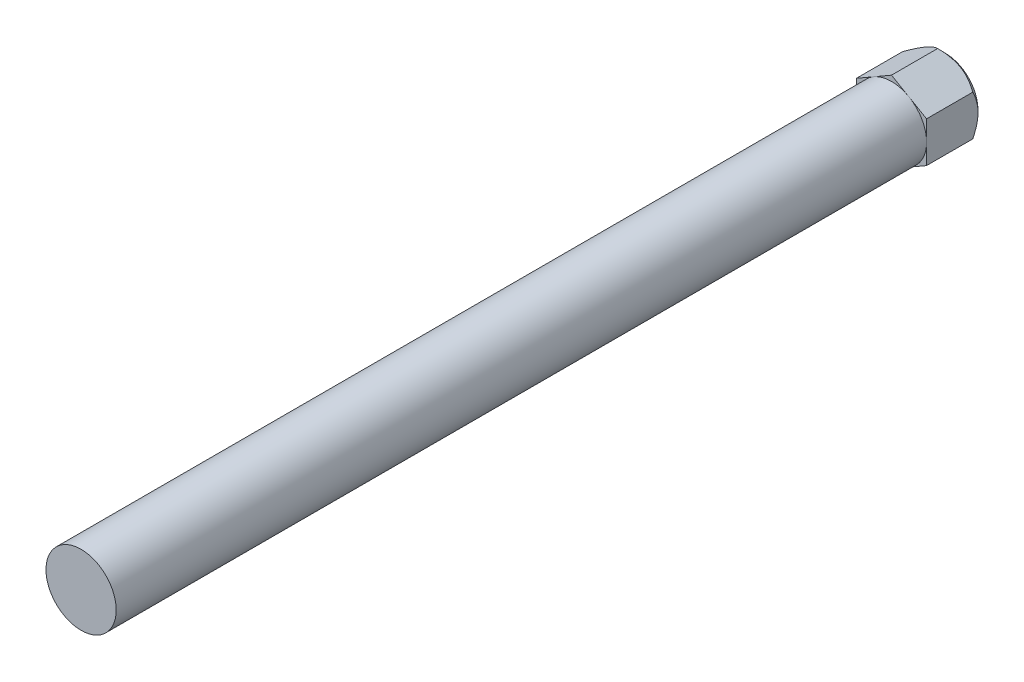
ISO-10303-21;
HEADER;
FILE_DESCRIPTION(('STEP AP214'),'2;1');
FILE_NAME('part.step','',(''),(''),'','','');
FILE_SCHEMA(('AUTOMOTIVE_DESIGN { 1 0 10303 214 1 1 1 1 }'));
ENDSEC;
DATA;
#1=APPLICATION_CONTEXT('core data for automotive mechanical design processes');
#2=APPLICATION_PROTOCOL_DEFINITION('international standard','automotive_design',2000,#1);
#3=PRODUCT_CONTEXT('',#1,'mechanical');
#4=PRODUCT('Part','Part','',(#3));
#5=PRODUCT_RELATED_PRODUCT_CATEGORY('part','',(#4));
#6=PRODUCT_DEFINITION_FORMATION('','',#4);
#7=PRODUCT_DEFINITION_CONTEXT('part definition',#1,'design');
#8=PRODUCT_DEFINITION('design','',#6,#7);
#9=PRODUCT_DEFINITION_SHAPE('','',#8);
#10=(LENGTH_UNIT() NAMED_UNIT(*) SI_UNIT(.MILLI.,.METRE.));
#11=(NAMED_UNIT(*) PLANE_ANGLE_UNIT() SI_UNIT($,.RADIAN.));
#12=(NAMED_UNIT(*) SI_UNIT($,.STERADIAN.) SOLID_ANGLE_UNIT());
#13=UNCERTAINTY_MEASURE_WITH_UNIT(LENGTH_MEASURE(1.E-05),#10,'distance_accuracy_value','');
#14=(GEOMETRIC_REPRESENTATION_CONTEXT(3) GLOBAL_UNCERTAINTY_ASSIGNED_CONTEXT((#13)) GLOBAL_UNIT_ASSIGNED_CONTEXT((#10,
#11,#12)) REPRESENTATION_CONTEXT('',''));
#15=CARTESIAN_POINT('',(0.,0.,0.));
#16=DIRECTION('',(0.,0.,1.));
#17=DIRECTION('',(1.,0.,0.));
#18=AXIS2_PLACEMENT_3D('',#15,#16,#17);
#19=CARTESIAN_POINT('',(0.129903810567665,0.0750000000000015,0.2));
#20=DIRECTION('',(-0.499999999999995,-0.866025403784441,0.));
#21=DIRECTION('',(0.866025403784441,-0.499999999999995,0.));
#22=AXIS2_PLACEMENT_3D('',#19,#20,#21);
#23=PLANE('',#22);
#24=CARTESIAN_POINT('',(-0.000225000000000034,0.150129903810568,0.0290416925238595));
#25=CARTESIAN_POINT('',(0.00440493001549842,0.147456812469791,0.0264662805790906));
#26=CARTESIAN_POINT('',(0.00910132930384536,0.144745345076442,0.024046366710727));
#27=CARTESIAN_POINT('',(0.0186727421920923,0.139219287268887,0.0196362097813889));
#28=CARTESIAN_POINT('',(0.0235486264427722,0.13640419418422,0.0176485132737686));
#29=CARTESIAN_POINT('',(0.0382402759105472,0.12792196640916,0.0126229968253295));
#30=CARTESIAN_POINT('',(0.0483001338299162,0.122113904731403,0.0104117823770408));
#31=CARTESIAN_POINT('',(0.0658404412441981,0.111987003524099,0.0092767657100801));
#32=CARTESIAN_POINT('',(0.0732867789702007,0.107687858433515,0.00962863214526663));
#33=CARTESIAN_POINT('',(0.0880016636542663,0.0991922158000751,0.0118879441990818));
#34=CARTESIAN_POINT('',(0.0952699155190242,0.0949958886294192,0.0137978127130971));
#35=CARTESIAN_POINT('',(0.107152446289047,0.0881355062906924,0.0179691136598692));
#36=CARTESIAN_POINT('',(0.111857024988693,0.0854193165120283,0.019911088131961));
#37=CARTESIAN_POINT('',(0.121106132544701,0.0800793417748031,0.0242007570717486));
#38=CARTESIAN_POINT('',(0.125651196440504,0.0774552479110774,0.0265468993747505));
#39=CARTESIAN_POINT('',(0.130128810567773,0.0748700961893716,0.0290416925234508));
#40=B_SPLINE_CURVE_WITH_KNOTS('',3,(#24,#25,#26,#27,#28,#29,#30,#31,#32,#33,#34,#35,#36,#37,#38,
#39),.UNSPECIFIED.,.F.,.F.,(4,2,2,2,2,2,2,4),(0.,0.0177981026650243,0.0356983863816638,
0.0708014543016663,0.0964614096499663,0.122161345802402,0.139452968543099,0.156679607584544),.UNSPECIFIED.);
#41=CARTESIAN_POINT('',(0.,0.15,0.0289163186776053));
#42=VERTEX_POINT('',#41);
#43=CARTESIAN_POINT('',(0.129903810567665,0.0750000000000015,0.0289163186776074));
#44=VERTEX_POINT('',#43);
#45=EDGE_CURVE('E55',#42,#44,#40,.T.);
#46=ORIENTED_EDGE('',*,*,#45,.F.);
#47=DIRECTION('',(0.,0.,-1.));
#48=VECTOR('',#47,1.);
#49=CARTESIAN_POINT('',(0.,0.15,0.2));
#50=LINE('',#49,#48);
#51=CARTESIAN_POINT('',(0.,0.15,0.2));
#52=VERTEX_POINT('',#51);
#53=EDGE_CURVE('E164',#52,#42,#50,.T.);
#54=ORIENTED_EDGE('',*,*,#53,.F.);
#55=DIRECTION('',(-0.866025403784442,0.499999999999995,0.));
#56=VECTOR('',#55,1.);
#57=CARTESIAN_POINT('',(0.129903810567665,0.0750000000000015,0.2));
#58=LINE('',#57,#56);
#59=CARTESIAN_POINT('',(0.0606217782649196,0.114999999999995,0.2));
#60=VERTEX_POINT('',#59);
#61=EDGE_CURVE('E41',#60,#52,#58,.T.);
#62=ORIENTED_EDGE('',*,*,#61,.F.);
#63=CARTESIAN_POINT('',(0.,0.,0.2));
#64=DIRECTION('',(0.,0.,1.));
#65=DIRECTION('',(0.532938710021118,0.846153846153893,0.));
#66=AXIS2_PLACEMENT_3D('',#63,#64,#65);
#67=CIRCLE('',#66,0.13);
#68=CARTESIAN_POINT('',(0.0692820323027454,0.110000000000006,0.2));
#69=VERTEX_POINT('',#68);
#70=EDGE_CURVE('E361',#69,#60,#67,.T.);
#71=ORIENTED_EDGE('',*,*,#70,.F.);
#72=CARTESIAN_POINT('',(0.129903810567665,0.0750000000000015,0.2));
#73=VERTEX_POINT('',#72);
#74=EDGE_CURVE('E372',#73,#69,#58,.T.);
#75=ORIENTED_EDGE('',*,*,#74,.F.);
#76=DIRECTION('',(0.,0.,-1.));
#77=VECTOR('',#76,1.);
#78=CARTESIAN_POINT('',(0.129903810567665,0.0750000000000015,0.2));
#79=LINE('',#78,#77);
#80=EDGE_CURVE('E158',#73,#44,#79,.T.);
#81=ORIENTED_EDGE('',*,*,#80,.T.);
#82=EDGE_LOOP('',(#46,#54,#62,#71,#75,#81));
#83=FACE_BOUND('',#82,.T.);
#84=ADVANCED_FACE('F37',(#83),#23,.F.);
#85=CARTESIAN_POINT('',(0.,0.15,0.2));
#86=DIRECTION('',(0.500000000000001,-0.866025403784438,0.));
#87=DIRECTION('',(0.866025403784438,0.500000000000001,0.));
#88=AXIS2_PLACEMENT_3D('',#85,#86,#87);
#89=PLANE('',#88);
#90=CARTESIAN_POINT('',(-0.130128810567666,0.074870096189432,0.02904169252386));
#91=CARTESIAN_POINT('',(-0.125498880552167,0.0775431875302092,0.026466280579091));
#92=CARTESIAN_POINT('',(-0.120802481263821,0.0802546549235583,0.0240463667107274));
#93=CARTESIAN_POINT('',(-0.111231068375574,0.0857807127311127,0.0196362097813891));
#94=CARTESIAN_POINT('',(-0.106355184124894,0.0885958058157803,0.0176485132737687));
#95=CARTESIAN_POINT('',(-0.0916635346571185,0.0970780335908399,0.0126229968253294));
#96=CARTESIAN_POINT('',(-0.0816036767377495,0.102886095268597,0.0104117823770405));
#97=CARTESIAN_POINT('',(-0.0640633693234676,0.113012996475901,0.00927676571007957));
#98=CARTESIAN_POINT('',(-0.056617031597465,0.117312141566486,0.00962863214526604));
#99=CARTESIAN_POINT('',(-0.0419021469133995,0.125807784199925,0.0118879441990811));
#100=CARTESIAN_POINT('',(-0.0346338950486416,0.130004111370581,0.0137978127130963));
#101=CARTESIAN_POINT('',(-0.0227513642786183,0.136864493709308,0.0179691136598683));
#102=CARTESIAN_POINT('',(-0.0180467855789726,0.139580683487973,0.0199110881319602));
#103=CARTESIAN_POINT('',(-0.00879767802296392,0.144920658225198,0.0242007570717479));
#104=CARTESIAN_POINT('',(-0.00425261412716102,0.147544752088924,0.0265468993747499));
#105=CARTESIAN_POINT('',(0.000225000000107818,0.15012990381063,0.0290416925234503));
#106=B_SPLINE_CURVE_WITH_KNOTS('',3,(#90,#91,#92,#93,#94,#95,#96,#97,#98,#99,#100,#101,#102,
#103,#104,#105),.UNSPECIFIED.,.F.,.F.,(4,2,2,2,2,2,2,4),(0.,0.0177981026650245,
0.0356983863816643,0.0708014543016672,0.0964614096499672,0.122161345802402,0.1394529685431,
0.156679607584546),.UNSPECIFIED.);
#107=CARTESIAN_POINT('',(-0.129903810567666,0.0749999999999996,0.0289163186776059));
#108=VERTEX_POINT('',#107);
#109=EDGE_CURVE('E232',#108,#42,#106,.T.);
#110=ORIENTED_EDGE('',*,*,#109,.F.);
#111=DIRECTION('',(0.,0.,-1.));
#112=VECTOR('',#111,1.);
#113=CARTESIAN_POINT('',(-0.129903810567666,0.0749999999999997,0.2));
#114=LINE('',#113,#112);
#115=CARTESIAN_POINT('',(-0.129903810567666,0.0749999999999997,0.2));
#116=VERTEX_POINT('',#115);
#117=EDGE_CURVE('E156',#116,#108,#114,.T.);
#118=ORIENTED_EDGE('',*,*,#117,.F.);
#119=DIRECTION('',(-0.866025403784438,-0.500000000000001,0.));
#120=VECTOR('',#119,1.);
#121=CARTESIAN_POINT('',(0.,0.15,0.2));
#122=LINE('',#121,#120);
#123=CARTESIAN_POINT('',(-0.0692820323027576,0.109999999999998,0.2));
#124=VERTEX_POINT('',#123);
#125=EDGE_CURVE('E374',#124,#116,#122,.T.);
#126=ORIENTED_EDGE('',*,*,#125,.F.);
#127=CARTESIAN_POINT('',(0.,0.,0.2));
#128=DIRECTION('',(0.,0.,1.));
#129=DIRECTION('',(-0.466321371268526,0.884615384615394,0.));
#130=AXIS2_PLACEMENT_3D('',#127,#128,#129);
#131=CIRCLE('',#130,0.13);
#132=CARTESIAN_POINT('',(-0.0606217782649084,0.115000000000001,0.2));
#133=VERTEX_POINT('',#132);
#134=EDGE_CURVE('E386',#133,#124,#131,.T.);
#135=ORIENTED_EDGE('',*,*,#134,.F.);
#136=EDGE_CURVE('E260',#52,#133,#122,.T.);
#137=ORIENTED_EDGE('',*,*,#136,.F.);
#138=ORIENTED_EDGE('',*,*,#53,.T.);
#139=EDGE_LOOP('',(#110,#118,#126,#135,#137,#138));
#140=FACE_BOUND('',#139,.T.);
#141=ADVANCED_FACE('F242',(#140),#89,.F.);
#142=CARTESIAN_POINT('',(-0.129903810567666,0.0749999999999997,0.2));
#143=DIRECTION('',(1.,0.,0.));
#144=DIRECTION('',(0.,1.,0.));
#145=AXIS2_PLACEMENT_3D('',#142,#143,#144);
#146=PLANE('',#145);
#147=CARTESIAN_POINT('',(-0.129903810567665,-0.0752250000000006,0.0290248767718918));
#148=CARTESIAN_POINT('',(-0.129903810567665,-0.0698809621175126,0.0264513776861215));
#149=CARTESIAN_POINT('',(-0.129903810567665,-0.0644602116700959,0.0240333468260614));
#150=CARTESIAN_POINT('',(-0.129903810567666,-0.0534126724141966,0.0196267725487518));
#151=CARTESIAN_POINT('',(-0.129903810567666,-0.047784880507002,0.0176407710038119));
#152=CARTESIAN_POINT('',(-0.129903810567666,-0.0308276142680169,0.0126196439930497));
#153=CARTESIAN_POINT('',(-0.129903810567666,-0.0192165977609575,0.0104106359543872));
#154=CARTESIAN_POINT('',(-0.129903810567666,0.00103175531092446,0.00927682483446629));
#155=CARTESIAN_POINT('',(-0.129903810567666,0.00962981045664214,0.00962904722870794));
#156=CARTESIAN_POINT('',(-0.129903810567666,0.0266205653232763,0.0118889307188861));
#157=CARTESIAN_POINT('',(-0.129903810567666,0.0350129247736064,0.0137990106921823));
#158=CARTESIAN_POINT('',(-0.129903810567666,0.0487264351488756,0.0179684949926959));
#159=CARTESIAN_POINT('',(-0.129903810567666,0.0541520661260957,0.0199078316637676));
#160=CARTESIAN_POINT('',(-0.129903810567666,0.0648189515033825,0.0241913045376229));
#161=CARTESIAN_POINT('',(-0.129903810567666,0.0700608220810997,0.0265338923656567));
#162=CARTESIAN_POINT('',(-0.129903810567666,0.0752250000001232,0.0290248767714845));
#163=B_SPLINE_CURVE_WITH_KNOTS('',3,(#147,#148,#149,#150,#151,#152,#153,#154,#155,#156,#157,
#158,#159,#160,#161,#162),.UNSPECIFIED.,.F.,.F.,(4,2,2,2,2,2,2,4),(0.,0.0177898229142681,
0.0356816405905399,0.0707688613278053,0.0964281734925292,0.122127402756694,0.139397361419401,
0.156602429884738),.UNSPECIFIED.);
#164=CARTESIAN_POINT('',(-0.129903810567664,-0.0750000000000025,0.0289163186776069));
#165=VERTEX_POINT('',#164);
#166=EDGE_CURVE('E149',#165,#108,#163,.T.);
#167=ORIENTED_EDGE('',*,*,#166,.F.);
#168=DIRECTION('',(0.,0.,-1.));
#169=VECTOR('',#168,1.);
#170=CARTESIAN_POINT('',(-0.129903810567665,-0.0750000000000006,0.2));
#171=LINE('',#170,#169);
#172=CARTESIAN_POINT('',(-0.129903810567665,-0.0750000000000006,0.2));
#173=VERTEX_POINT('',#172);
#174=EDGE_CURVE('E148',#173,#165,#171,.T.);
#175=ORIENTED_EDGE('',*,*,#174,.F.);
#176=DIRECTION('',(0.,-1.,0.));
#177=VECTOR('',#176,1.);
#178=CARTESIAN_POINT('',(-0.129903810567666,0.0749999999999997,0.2));
#179=LINE('',#178,#177);
#180=CARTESIAN_POINT('',(-0.129903810567666,-0.00500000000000326,0.2));
#181=VERTEX_POINT('',#180);
#182=EDGE_CURVE('E311',#181,#173,#179,.T.);
#183=ORIENTED_EDGE('',*,*,#182,.F.);
#184=CARTESIAN_POINT('',(0.,0.,0.2));
#185=DIRECTION('',(0.,0.,1.));
#186=DIRECTION('',(-0.999260081289736,0.0384615384615572,0.));
#187=AXIS2_PLACEMENT_3D('',#184,#185,#186);
#188=CIRCLE('',#187,0.13);
#189=CARTESIAN_POINT('',(-0.129903810567666,0.00500000000000241,0.2));
#190=VERTEX_POINT('',#189);
#191=EDGE_CURVE('E315',#190,#181,#188,.T.);
#192=ORIENTED_EDGE('',*,*,#191,.F.);
#193=EDGE_CURVE('E321',#116,#190,#179,.T.);
#194=ORIENTED_EDGE('',*,*,#193,.F.);
#195=ORIENTED_EDGE('',*,*,#117,.T.);
#196=EDGE_LOOP('',(#167,#175,#183,#192,#194,#195));
#197=FACE_BOUND('',#196,.T.);
#198=ADVANCED_FACE('F245',(#197),#146,.F.);
#199=CARTESIAN_POINT('',(-0.129903810567665,-0.0750000000000006,0.2));
#200=DIRECTION('',(0.499999999999995,0.866025403784442,0.));
#201=DIRECTION('',(-0.866025403784442,0.499999999999995,0.));
#202=AXIS2_PLACEMENT_3D('',#199,#200,#201);
#203=PLANE('',#202);
#204=CARTESIAN_POINT('',(0.000225000000001057,-0.150129903810568,0.0290416925238618));
#205=CARTESIAN_POINT('',(-0.00440493001549743,-0.147456812469791,0.0264662805790928));
#206=CARTESIAN_POINT('',(-0.00910132930384438,-0.144745345076441,0.0240463667107292));
#207=CARTESIAN_POINT('',(-0.0186727421920913,-0.139219287268887,0.0196362097813909));
#208=CARTESIAN_POINT('',(-0.0235486264427713,-0.13640419418422,0.0176485132737704));
#209=CARTESIAN_POINT('',(-0.0382402759105464,-0.12792196640916,0.0126229968253311));
#210=CARTESIAN_POINT('',(-0.0483001338299154,-0.122113904731403,0.0104117823770422));
#211=CARTESIAN_POINT('',(-0.0658404412441974,-0.111987003524099,0.00927676571008123));
#212=CARTESIAN_POINT('',(-0.0732867789701999,-0.107687858433514,0.00962863214526765));
#213=CARTESIAN_POINT('',(-0.0880016636542653,-0.0991922158000751,0.0118879441990826));
#214=CARTESIAN_POINT('',(-0.0952699155190232,-0.0949958886294192,0.0137978127130978));
#215=CARTESIAN_POINT('',(-0.107152446289047,-0.0881355062906923,0.0179691136598698));
#216=CARTESIAN_POINT('',(-0.111857024988692,-0.085419316512028,0.0199110881319618));
#217=CARTESIAN_POINT('',(-0.121106132544701,-0.0800793417748025,0.0242007570717495));
#218=CARTESIAN_POINT('',(-0.125651196440504,-0.0774552479110766,0.0265468993747516));
#219=CARTESIAN_POINT('',(-0.130128810567773,-0.0748700961893707,0.0290416925234521));
#220=B_SPLINE_CURVE_WITH_KNOTS('',3,(#204,#205,#206,#207,#208,#209,#210,#211,#212,#213,#214,
#215,#216,#217,#218,#219),.UNSPECIFIED.,.F.,.F.,(4,2,2,2,2,2,2,4),(0.,0.0177981026650245,
0.0356983863816642,0.070801454301667,0.0964614096499667,0.122161345802402,0.1394529685431,
0.156679607584546),.UNSPECIFIED.);
#221=CARTESIAN_POINT('',(0.,-0.15,0.0289163186776074));
#222=VERTEX_POINT('',#221);
#223=EDGE_CURVE('E131',#222,#165,#220,.T.);
#224=ORIENTED_EDGE('',*,*,#223,.F.);
#225=DIRECTION('',(0.,0.,-1.));
#226=VECTOR('',#225,1.);
#227=CARTESIAN_POINT('',(0.,-0.15,0.2));
#228=LINE('',#227,#226);
#229=CARTESIAN_POINT('',(0.,-0.15,0.2));
#230=VERTEX_POINT('',#229);
#231=EDGE_CURVE('E144',#230,#222,#228,.T.);
#232=ORIENTED_EDGE('',*,*,#231,.F.);
#233=DIRECTION('',(0.866025403784442,-0.499999999999995,0.));
#234=VECTOR('',#233,1.);
#235=CARTESIAN_POINT('',(-0.129903810567665,-0.0750000000000006,0.2));
#236=LINE('',#235,#234);
#237=CARTESIAN_POINT('',(-0.0606217782649069,-0.115000000000002,0.2));
#238=VERTEX_POINT('',#237);
#239=EDGE_CURVE('E291',#238,#230,#236,.T.);
#240=ORIENTED_EDGE('',*,*,#239,.F.);
#241=CARTESIAN_POINT('',(0.,0.,0.2));
#242=DIRECTION('',(0.,0.,1.));
#243=DIRECTION('',(-0.532938710021211,-0.846153846153835,0.));
#244=AXIS2_PLACEMENT_3D('',#241,#242,#243);
#245=CIRCLE('',#244,0.13);
#246=CARTESIAN_POINT('',(-0.0692820323027574,-0.109999999999999,0.2));
#247=VERTEX_POINT('',#246);
#248=EDGE_CURVE('E290',#247,#238,#245,.T.);
#249=ORIENTED_EDGE('',*,*,#248,.F.);
#250=EDGE_CURVE('E285',#173,#247,#236,.T.);
#251=ORIENTED_EDGE('',*,*,#250,.F.);
#252=ORIENTED_EDGE('',*,*,#174,.T.);
#253=EDGE_LOOP('',(#224,#232,#240,#249,#251,#252));
#254=FACE_BOUND('',#253,.T.);
#255=ADVANCED_FACE('F142',(#254),#203,.F.);
#256=CARTESIAN_POINT('',(0.,-0.15,0.2));
#257=DIRECTION('',(-0.500000000000007,0.866025403784435,0.));
#258=DIRECTION('',(-0.866025403784435,-0.500000000000007,0.));
#259=AXIS2_PLACEMENT_3D('',#256,#257,#258);
#260=PLANE('',#259);
#261=CARTESIAN_POINT('',(0.130128810567666,-0.0748700961894311,0.0290416925238612));
#262=CARTESIAN_POINT('',(0.125498880552168,-0.0775431875302083,0.0264662805790923));
#263=CARTESIAN_POINT('',(0.120802481263821,-0.0802546549235574,0.0240463667107287));
#264=CARTESIAN_POINT('',(0.111231068375574,-0.0857807127311119,0.0196362097813904));
#265=CARTESIAN_POINT('',(0.106355184124894,-0.0885958058157795,0.01764851327377));
#266=CARTESIAN_POINT('',(0.0916635346571192,-0.0970780335908392,0.0126229968253308));
#267=CARTESIAN_POINT('',(0.0816036767377503,-0.102886095268596,0.010411782377042));
#268=CARTESIAN_POINT('',(0.0640633693234686,-0.113012996475901,0.00927676571008123));
#269=CARTESIAN_POINT('',(0.0566170315974661,-0.117312141566485,0.00962863214526774));
#270=CARTESIAN_POINT('',(0.0419021469134008,-0.125807784199925,0.0118879441990828));
#271=CARTESIAN_POINT('',(0.034633895048643,-0.130004111370581,0.0137978127130981));
#272=CARTESIAN_POINT('',(0.0227513642786198,-0.136864493709308,0.0179691136598702));
#273=CARTESIAN_POINT('',(0.0180467855789739,-0.139580683487972,0.0199110881319622));
#274=CARTESIAN_POINT('',(0.00879767802296512,-0.144920658225198,0.02420075707175));
#275=CARTESIAN_POINT('',(0.00425261412716214,-0.147544752088924,0.0265468993747522));
#276=CARTESIAN_POINT('',(-0.000225000000106775,-0.15012990381063,0.0290416925234527));
#277=B_SPLINE_CURVE_WITH_KNOTS('',3,(#261,#262,#263,#264,#265,#266,#267,#268,#269,#270,#271,
#272,#273,#274,#275,#276),.UNSPECIFIED.,.F.,.F.,(4,2,2,2,2,2,2,4),(0.,0.0177981026650245,
0.0356983863816642,0.0708014543016669,0.0964614096499666,0.122161345802402,0.1394529685431,
0.156679607584546),.UNSPECIFIED.);
#278=CARTESIAN_POINT('',(0.129903810567666,-0.0749999999999985,0.0289163186776069));
#279=VERTEX_POINT('',#278);
#280=EDGE_CURVE('E128',#279,#222,#277,.T.);
#281=ORIENTED_EDGE('',*,*,#280,.F.);
#282=DIRECTION('',(0.,0.,-1.));
#283=VECTOR('',#282,1.);
#284=CARTESIAN_POINT('',(0.129903810567666,-0.0749999999999988,0.2));
#285=LINE('',#284,#283);
#286=CARTESIAN_POINT('',(0.129903810567666,-0.0749999999999988,0.2));
#287=VERTEX_POINT('',#286);
#288=EDGE_CURVE('E154',#287,#279,#285,.T.);
#289=ORIENTED_EDGE('',*,*,#288,.F.);
#290=DIRECTION('',(0.866025403784434,0.500000000000007,0.));
#291=VECTOR('',#290,1.);
#292=CARTESIAN_POINT('',(0.,-0.15,0.2));
#293=LINE('',#292,#291);
#294=CARTESIAN_POINT('',(0.0692820323027595,-0.109999999999997,0.2));
#295=VERTEX_POINT('',#294);
#296=EDGE_CURVE('E289',#295,#287,#293,.T.);
#297=ORIENTED_EDGE('',*,*,#296,.F.);
#298=CARTESIAN_POINT('',(0.,0.,0.2));
#299=DIRECTION('',(0.,0.,1.));
#300=DIRECTION('',(0.466321371268523,-0.884615384615396,0.));
#301=AXIS2_PLACEMENT_3D('',#298,#299,#300);
#302=CIRCLE('',#301,0.13);
#303=CARTESIAN_POINT('',(0.060621778264908,-0.115000000000001,0.2));
#304=VERTEX_POINT('',#303);
#305=EDGE_CURVE('E303',#304,#295,#302,.T.);
#306=ORIENTED_EDGE('',*,*,#305,.F.);
#307=EDGE_CURVE('E153',#230,#304,#293,.T.);
#308=ORIENTED_EDGE('',*,*,#307,.F.);
#309=ORIENTED_EDGE('',*,*,#231,.T.);
#310=EDGE_LOOP('',(#281,#289,#297,#306,#308,#309));
#311=FACE_BOUND('',#310,.T.);
#312=ADVANCED_FACE('F151',(#311),#260,.F.);
#313=CARTESIAN_POINT('',(0.129903810567666,-0.0749999999999988,0.2));
#314=DIRECTION('',(-1.,0.,0.));
#315=DIRECTION('',(0.,-1.,0.));
#316=AXIS2_PLACEMENT_3D('',#313,#314,#315);
#317=PLANE('',#316);
#318=CARTESIAN_POINT('',(0.129903810567665,0.0752250000000015,0.0290248767718905));
#319=CARTESIAN_POINT('',(0.129903810567665,0.0698809621175135,0.0264513776861204));
#320=CARTESIAN_POINT('',(0.129903810567665,0.0644602116700968,0.0240333468260603));
#321=CARTESIAN_POINT('',(0.129903810567665,0.0534126724141975,0.019626772548751));
#322=CARTESIAN_POINT('',(0.129903810567665,0.0477848805070029,0.0176407710038112));
#323=CARTESIAN_POINT('',(0.129903810567665,0.0308276142680178,0.0126196439930492));
#324=CARTESIAN_POINT('',(0.129903810567665,0.0192165977609584,0.0104106359543869));
#325=CARTESIAN_POINT('',(0.129903810567666,-0.00103175531092346,0.00927682483446628));
#326=CARTESIAN_POINT('',(0.129903810567666,-0.00962981045664113,0.00962904722870805));
#327=CARTESIAN_POINT('',(0.129903810567666,-0.0266205653232753,0.0118889307188865));
#328=CARTESIAN_POINT('',(0.129903810567666,-0.0350129247736054,0.0137990106921827));
#329=CARTESIAN_POINT('',(0.129903810567666,-0.0487264351488746,0.0179684949926965));
#330=CARTESIAN_POINT('',(0.129903810567666,-0.0541520661260946,0.0199078316637683));
#331=CARTESIAN_POINT('',(0.129903810567666,-0.0648189515033815,0.0241913045376239));
#332=CARTESIAN_POINT('',(0.129903810567666,-0.0700608220810988,0.0265338923656578));
#333=CARTESIAN_POINT('',(0.129903810567666,-0.0752250000001223,0.0290248767714858));
#334=B_SPLINE_CURVE_WITH_KNOTS('',3,(#318,#319,#320,#321,#322,#323,#324,#325,#326,#327,#328,
#329,#330,#331,#332,#333),.UNSPECIFIED.,.F.,.F.,(4,2,2,2,2,2,2,4),(0.,0.017789822914268,
0.0356816405905397,0.070768861327805,0.0964281734925288,0.122127402756693,0.139397361419401,
0.156602429884738),.UNSPECIFIED.);
#335=EDGE_CURVE('E133',#44,#279,#334,.T.);
#336=ORIENTED_EDGE('',*,*,#335,.F.);
#337=ORIENTED_EDGE('',*,*,#80,.F.);
#338=DIRECTION('',(0.,1.,0.));
#339=VECTOR('',#338,1.);
#340=CARTESIAN_POINT('',(0.129903810567666,-0.0749999999999988,0.2));
#341=LINE('',#340,#339);
#342=CARTESIAN_POINT('',(0.129903810567666,0.00500000000000486,0.2));
#343=VERTEX_POINT('',#342);
#344=EDGE_CURVE('E410',#343,#73,#341,.T.);
#345=ORIENTED_EDGE('',*,*,#344,.F.);
#346=CARTESIAN_POINT('',(0.,0.,0.2));
#347=DIRECTION('',(0.,0.,1.));
#348=DIRECTION('',(0.999260081289736,-0.0384615384615552,0.));
#349=AXIS2_PLACEMENT_3D('',#346,#347,#348);
#350=CIRCLE('',#349,0.13);
#351=CARTESIAN_POINT('',(0.129903810567666,-0.00500000000000214,0.2));
#352=VERTEX_POINT('',#351);
#353=EDGE_CURVE('E173',#352,#343,#350,.T.);
#354=ORIENTED_EDGE('',*,*,#353,.F.);
#355=EDGE_CURVE('E407',#287,#352,#341,.T.);
#356=ORIENTED_EDGE('',*,*,#355,.F.);
#357=ORIENTED_EDGE('',*,*,#288,.T.);
#358=EDGE_LOOP('',(#336,#337,#345,#354,#356,#357));
#359=FACE_BOUND('',#358,.T.);
#360=ADVANCED_FACE('F181',(#359),#317,.F.);
#361=CARTESIAN_POINT('',(0.,0.,0.2));
#362=DIRECTION('',(0.,0.,1.));
#363=DIRECTION('',(1.,0.,0.));
#364=AXIS2_PLACEMENT_3D('',#361,#362,#363);
#365=PLANE('',#364);
#366=CARTESIAN_POINT('',(0.,0.,0.2));
#367=DIRECTION('',(0.,0.,1.));
#368=DIRECTION('',(1.,0.,0.));
#369=AXIS2_PLACEMENT_3D('',#366,#367,#368);
#370=CIRCLE('',#369,0.13);
#371=EDGE_CURVE('E63',#343,#69,#370,.T.);
#372=ORIENTED_EDGE('',*,*,#371,.F.);
#373=ORIENTED_EDGE('',*,*,#344,.T.);
#374=ORIENTED_EDGE('',*,*,#74,.T.);
#375=EDGE_LOOP('',(#372,#373,#374));
#376=FACE_BOUND('',#375,.T.);
#377=ADVANCED_FACE('F191',(#376),#365,.T.);
#378=EDGE_CURVE('E11',#60,#133,#370,.T.);
#379=ORIENTED_EDGE('',*,*,#378,.F.);
#380=ORIENTED_EDGE('',*,*,#61,.T.);
#381=ORIENTED_EDGE('',*,*,#136,.T.);
#382=EDGE_LOOP('',(#379,#380,#381));
#383=FACE_BOUND('',#382,.T.);
#384=ADVANCED_FACE('F455',(#383),#365,.T.);
#385=EDGE_CURVE('E47',#124,#190,#370,.T.);
#386=ORIENTED_EDGE('',*,*,#385,.F.);
#387=ORIENTED_EDGE('',*,*,#125,.T.);
#388=ORIENTED_EDGE('',*,*,#193,.T.);
#389=EDGE_LOOP('',(#386,#387,#388));
#390=FACE_BOUND('',#389,.T.);
#391=ADVANCED_FACE('F461',(#390),#365,.T.);
#392=EDGE_CURVE('E278',#181,#247,#370,.T.);
#393=ORIENTED_EDGE('',*,*,#392,.F.);
#394=ORIENTED_EDGE('',*,*,#182,.T.);
#395=ORIENTED_EDGE('',*,*,#250,.T.);
#396=EDGE_LOOP('',(#393,#394,#395));
#397=FACE_BOUND('',#396,.T.);
#398=ADVANCED_FACE('F309',(#397),#365,.T.);
#399=EDGE_CURVE('E274',#238,#304,#370,.T.);
#400=ORIENTED_EDGE('',*,*,#399,.F.);
#401=ORIENTED_EDGE('',*,*,#239,.T.);
#402=ORIENTED_EDGE('',*,*,#307,.T.);
#403=EDGE_LOOP('',(#400,#401,#402));
#404=FACE_BOUND('',#403,.T.);
#405=ADVANCED_FACE('F403',(#404),#365,.T.);
#406=EDGE_CURVE('E167',#295,#352,#370,.T.);
#407=ORIENTED_EDGE('',*,*,#406,.F.);
#408=ORIENTED_EDGE('',*,*,#296,.T.);
#409=ORIENTED_EDGE('',*,*,#355,.T.);
#410=EDGE_LOOP('',(#407,#408,#409));
#411=FACE_BOUND('',#410,.T.);
#412=ADVANCED_FACE('F337',(#411),#365,.T.);
#413=CARTESIAN_POINT('',(0.,0.,3.2));
#414=DIRECTION('',(0.,0.,-1.));
#415=DIRECTION('',(-1.,0.,0.));
#416=AXIS2_PLACEMENT_3D('',#413,#414,#415);
#417=CYLINDRICAL_SURFACE('',#416,0.13);
#418=CARTESIAN_POINT('',(0.,0.,3.2));
#419=DIRECTION('',(0.,0.,1.));
#420=DIRECTION('',(1.,0.,0.));
#421=AXIS2_PLACEMENT_3D('',#418,#419,#420);
#422=CIRCLE('',#421,0.13);
#423=CARTESIAN_POINT('',(0.13,0.,3.2));
#424=VERTEX_POINT('',#423);
#425=EDGE_CURVE('E265',#424,#424,#422,.T.);
#426=ORIENTED_EDGE('',*,*,#425,.F.);
#427=EDGE_LOOP('',(#426));
#428=FACE_BOUND('',#427,.T.);
#429=ORIENTED_EDGE('',*,*,#371,.T.);
#430=ORIENTED_EDGE('',*,*,#70,.T.);
#431=ORIENTED_EDGE('',*,*,#378,.T.);
#432=ORIENTED_EDGE('',*,*,#134,.T.);
#433=ORIENTED_EDGE('',*,*,#385,.T.);
#434=ORIENTED_EDGE('',*,*,#191,.T.);
#435=ORIENTED_EDGE('',*,*,#392,.T.);
#436=ORIENTED_EDGE('',*,*,#248,.T.);
#437=ORIENTED_EDGE('',*,*,#399,.T.);
#438=ORIENTED_EDGE('',*,*,#305,.T.);
#439=ORIENTED_EDGE('',*,*,#406,.T.);
#440=ORIENTED_EDGE('',*,*,#353,.T.);
#441=EDGE_LOOP('',(#429,#430,#431,#432,#433,#434,#435,#436,#437,#438,#439,#440));
#442=FACE_BOUND('',#441,.T.);
#443=ADVANCED_FACE('F313',(#428,#442),#417,.T.);
#444=CARTESIAN_POINT('',(0.,0.,3.2));
#445=DIRECTION('',(0.,0.,1.));
#446=DIRECTION('',(1.,0.,0.));
#447=AXIS2_PLACEMENT_3D('',#444,#445,#446);
#448=PLANE('',#447);
#449=ORIENTED_EDGE('',*,*,#425,.T.);
#450=EDGE_LOOP('',(#449));
#451=FACE_BOUND('',#450,.T.);
#452=ADVANCED_FACE('F212',(#451),#448,.T.);
#453=CARTESIAN_POINT('',(0.,0.,0.0289163186776064));
#454=DIRECTION('',(0.,0.,1.));
#455=DIRECTION('',(0.,-1.,0.));
#456=AXIS2_PLACEMENT_3D('',#453,#454,#455);
#457=CONICAL_SURFACE('',#456,0.15,0.803789657637966);
#458=CARTESIAN_POINT('',(0.,0.,0.));
#459=DIRECTION('',(0.,0.,1.));
#460=DIRECTION('',(0.,-1.,0.));
#461=AXIS2_PLACEMENT_3D('',#458,#459,#460);
#462=CIRCLE('',#461,0.12);
#463=CARTESIAN_POINT('',(0.,-0.12,0.));
#464=VERTEX_POINT('',#463);
#465=EDGE_CURVE('E204',#464,#464,#462,.T.);
#466=ORIENTED_EDGE('',*,*,#465,.T.);
#467=EDGE_LOOP('',(#466));
#468=FACE_BOUND('',#467,.T.);
#469=ORIENTED_EDGE('',*,*,#45,.T.);
#470=ORIENTED_EDGE('',*,*,#335,.T.);
#471=ORIENTED_EDGE('',*,*,#280,.T.);
#472=ORIENTED_EDGE('',*,*,#223,.T.);
#473=ORIENTED_EDGE('',*,*,#166,.T.);
#474=ORIENTED_EDGE('',*,*,#109,.T.);
#475=EDGE_LOOP('',(#469,#470,#471,#472,#473,#474));
#476=FACE_BOUND('',#475,.T.);
#477=ADVANCED_FACE('F130',(#468,#476),#457,.T.);
#478=CARTESIAN_POINT('',(0.,0.,0.));
#479=DIRECTION('',(0.,0.,1.));
#480=DIRECTION('',(1.,0.,0.));
#481=AXIS2_PLACEMENT_3D('',#478,#479,#480);
#482=PLANE('',#481);
#483=ORIENTED_EDGE('',*,*,#465,.F.);
#484=EDGE_LOOP('',(#483));
#485=FACE_BOUND('',#484,.T.);
#486=ADVANCED_FACE('F192',(#485),#482,.F.);
#487=CLOSED_SHELL('',(#84,#141,#198,#255,#312,#360,#377,#384,#391,#398,#405,#412,#443,#452,#477,#486));
#488=MANIFOLD_SOLID_BREP('B2',#487);
#489=ADVANCED_BREP_SHAPE_REPRESENTATION('',(#18,#488),#14);
#490=SHAPE_DEFINITION_REPRESENTATION(#9,#489);
ENDSEC;
END-ISO-10303-21;
